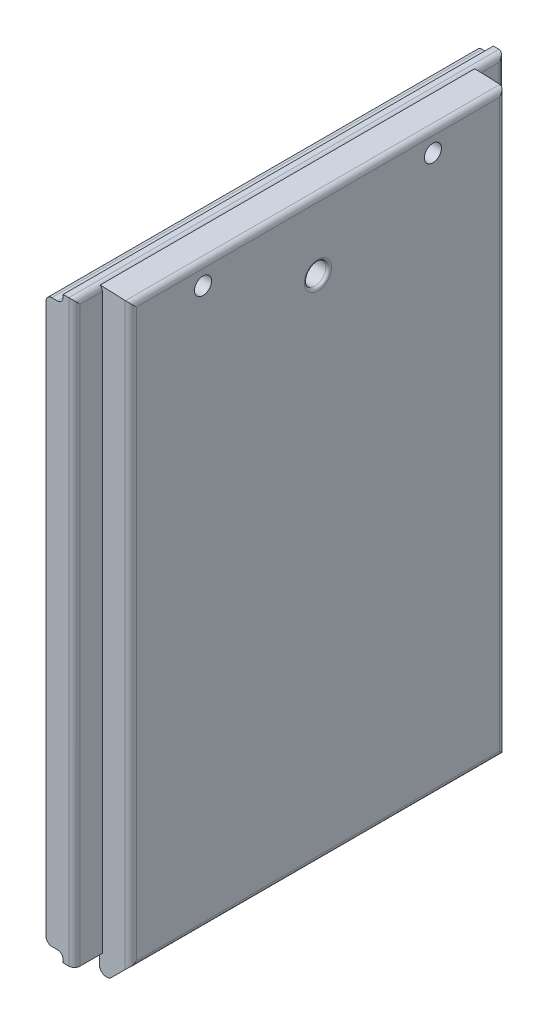
ISO-10303-21;
HEADER;
FILE_DESCRIPTION(('STEP AP214'),'2;1');
FILE_NAME('part.step','',(''),(''),'','','');
FILE_SCHEMA(('AUTOMOTIVE_DESIGN { 1 0 10303 214 1 1 1 1 }'));
ENDSEC;
DATA;
#1=APPLICATION_CONTEXT('core data for automotive mechanical design processes');
#2=APPLICATION_PROTOCOL_DEFINITION('international standard','automotive_design',2000,#1);
#3=PRODUCT_CONTEXT('',#1,'mechanical');
#4=PRODUCT('Part','Part','',(#3));
#5=PRODUCT_RELATED_PRODUCT_CATEGORY('part','',(#4));
#6=PRODUCT_DEFINITION_FORMATION('','',#4);
#7=PRODUCT_DEFINITION_CONTEXT('part definition',#1,'design');
#8=PRODUCT_DEFINITION('design','',#6,#7);
#9=PRODUCT_DEFINITION_SHAPE('','',#8);
#10=(LENGTH_UNIT() NAMED_UNIT(*) SI_UNIT(.MILLI.,.METRE.));
#11=(NAMED_UNIT(*) PLANE_ANGLE_UNIT() SI_UNIT($,.RADIAN.));
#12=(NAMED_UNIT(*) SI_UNIT($,.STERADIAN.) SOLID_ANGLE_UNIT());
#13=UNCERTAINTY_MEASURE_WITH_UNIT(LENGTH_MEASURE(1.E-05),#10,'distance_accuracy_value','');
#14=(GEOMETRIC_REPRESENTATION_CONTEXT(3) GLOBAL_UNCERTAINTY_ASSIGNED_CONTEXT((#13)) GLOBAL_UNIT_ASSIGNED_CONTEXT((#10,
#11,#12)) REPRESENTATION_CONTEXT('',''));
#15=CARTESIAN_POINT('',(0.,0.,0.));
#16=DIRECTION('',(0.,0.,1.));
#17=DIRECTION('',(1.,0.,0.));
#18=AXIS2_PLACEMENT_3D('',#15,#16,#17);
#19=CARTESIAN_POINT('',(-67.5,-51.0099999999999,38.));
#20=DIRECTION('',(-1.,0.,0.));
#21=DIRECTION('',(0.,0.,1.));
#22=AXIS2_PLACEMENT_3D('',#19,#20,#21);
#23=PLANE('',#22);
#24=DIRECTION('',(0.,0.,-1.));
#25=VECTOR('',#24,1.);
#26=CARTESIAN_POINT('',(-67.5,-50.9999999999999,0.));
#27=LINE('',#26,#25);
#28=CARTESIAN_POINT('',(-67.5,-50.9999999999999,-33.));
#29=VERTEX_POINT('',#28);
#30=CARTESIAN_POINT('',(-67.5,-50.9999999999999,-36.9000000000018));
#31=VERTEX_POINT('',#30);
#32=EDGE_CURVE('E279',#29,#31,#27,.T.);
#33=ORIENTED_EDGE('',*,*,#32,.T.);
#34=DIRECTION('',(0.,1.,0.));
#35=VECTOR('',#34,1.);
#36=CARTESIAN_POINT('',(-67.5,-51.0099999999995,-36.9000000000018));
#37=LINE('',#36,#35);
#38=CARTESIAN_POINT('',(-67.5,49.9999999999999,-36.9000000000011));
#39=VERTEX_POINT('',#38);
#40=EDGE_CURVE('E313',#31,#39,#37,.T.);
#41=ORIENTED_EDGE('',*,*,#40,.T.);
#42=DIRECTION('',(0.,0.,1.));
#43=VECTOR('',#42,1.);
#44=CARTESIAN_POINT('',(-67.5,49.9999999999999,37.9000000000011));
#45=LINE('',#44,#43);
#46=CARTESIAN_POINT('',(-67.5,49.9999999999999,-33.));
#47=VERTEX_POINT('',#46);
#48=EDGE_CURVE('E310',#39,#47,#45,.T.);
#49=ORIENTED_EDGE('',*,*,#48,.T.);
#50=DIRECTION('',(0.,1.,0.));
#51=VECTOR('',#50,1.);
#52=CARTESIAN_POINT('',(-67.5,-51.0099999999999,-33.));
#53=LINE('',#52,#51);
#54=EDGE_CURVE('E284',#29,#47,#53,.T.);
#55=ORIENTED_EDGE('',*,*,#54,.F.);
#56=EDGE_LOOP('',(#33,#41,#49,#55));
#57=FACE_BOUND('',#56,.T.);
#58=ADVANCED_FACE('F41',(#57),#23,.F.);
#59=CARTESIAN_POINT('',(-67.5,-51.0099999999999,-33.));
#60=DIRECTION('',(0.,0.,1.));
#61=DIRECTION('',(1.,0.,0.));
#62=AXIS2_PLACEMENT_3D('',#59,#60,#61);
#63=PLANE('',#62);
#64=CARTESIAN_POINT('',(-69.5,-50.9999999999999,-33.));
#65=DIRECTION('',(0.,0.,1.));
#66=DIRECTION('',(1.,0.,0.));
#67=AXIS2_PLACEMENT_3D('',#64,#65,#66);
#68=CIRCLE('',#67,101.8);
#69=CARTESIAN_POINT('',(-63.5,50.6230288861733,-33.));
#70=VERTEX_POINT('',#69);
#71=CARTESIAN_POINT('',(-67.8832523244408,50.7871609141035,-33.));
#72=VERTEX_POINT('',#71);
#73=EDGE_CURVE('E65',#70,#72,#68,.T.);
#74=ORIENTED_EDGE('',*,*,#73,.F.);
#75=DIRECTION('',(0.,-1.,0.));
#76=VECTOR('',#75,1.);
#77=CARTESIAN_POINT('',(-63.5,-50.9999999999999,-33.));
#78=LINE('',#77,#76);
#79=CARTESIAN_POINT('',(-63.5,-51.5,-32.9999999999999));
#80=VERTEX_POINT('',#79);
#81=EDGE_CURVE('E378',#70,#80,#78,.T.);
#82=ORIENTED_EDGE('',*,*,#81,.T.);
#83=DIRECTION('',(-0.707106781186559,-0.707106781186536,0.));
#84=VECTOR('',#83,1.);
#85=CARTESIAN_POINT('',(-62.9999999999999,-50.9999999999999,-32.9999999999999));
#86=LINE('',#85,#84);
#87=CARTESIAN_POINT('',(-65.8786796564404,-53.8786796564403,-32.9999999999999));
#88=VERTEX_POINT('',#87);
#89=EDGE_CURVE('E467',#80,#88,#86,.T.);
#90=ORIENTED_EDGE('',*,*,#89,.T.);
#91=CARTESIAN_POINT('',(-66.7573593128807,-52.9999999999999,-32.9999999999999));
#92=DIRECTION('',(0.,0.,-1.));
#93=DIRECTION('',(-1.,0.,0.));
#94=AXIS2_PLACEMENT_3D('',#91,#92,#93);
#95=CIRCLE('',#94,1.24264068711925);
#96=CARTESIAN_POINT('',(-67.9999999999999,-52.9999999999999,-32.9999999999999));
#97=VERTEX_POINT('',#96);
#98=EDGE_CURVE('E463',#88,#97,#95,.T.);
#99=ORIENTED_EDGE('',*,*,#98,.T.);
#100=DIRECTION('',(0.,1.,0.));
#101=VECTOR('',#100,1.);
#102=CARTESIAN_POINT('',(-67.9999999999999,-50.9999999999999,-32.9999999999999));
#103=LINE('',#102,#101);
#104=CARTESIAN_POINT('',(-67.9999999999999,-50.9999999999999,-32.9999999999999));
#105=VERTEX_POINT('',#104);
#106=EDGE_CURVE('E448',#97,#105,#103,.T.);
#107=ORIENTED_EDGE('',*,*,#106,.T.);
#108=DIRECTION('',(1.,0.,0.));
#109=VECTOR('',#108,1.);
#110=CARTESIAN_POINT('',(-67.9999999999999,-50.9999999999999,-32.9999999999999));
#111=LINE('',#110,#109);
#112=EDGE_CURVE('E470',#105,#29,#111,.T.);
#113=ORIENTED_EDGE('',*,*,#112,.T.);
#114=ORIENTED_EDGE('',*,*,#54,.T.);
#115=CARTESIAN_POINT('',(-68.5,49.9999999999999,-33.));
#116=DIRECTION('',(0.,0.,1.));
#117=DIRECTION('',(1.,0.,0.));
#118=AXIS2_PLACEMENT_3D('',#115,#116,#117);
#119=CIRCLE('',#118,1.);
#120=EDGE_CURVE('E390',#47,#72,#119,.T.);
#121=ORIENTED_EDGE('',*,*,#120,.T.);
#122=EDGE_LOOP('',(#74,#82,#90,#99,#107,#113,#114,#121));
#123=FACE_BOUND('',#122,.T.);
#124=ADVANCED_FACE('F606',(#123),#63,.F.);
#125=CARTESIAN_POINT('',(-67.5,-51.0099999999999,33.));
#126=DIRECTION('',(0.,0.,-1.));
#127=DIRECTION('',(-1.,0.,0.));
#128=AXIS2_PLACEMENT_3D('',#125,#126,#127);
#129=PLANE('',#128);
#130=DIRECTION('',(0.707106781186559,0.707106781186535,0.));
#131=VECTOR('',#130,1.);
#132=CARTESIAN_POINT('',(-62.9999999999999,-50.9999999999999,33.));
#133=LINE('',#132,#131);
#134=CARTESIAN_POINT('',(-65.8786796564404,-53.8786796564403,33.));
#135=VERTEX_POINT('',#134);
#136=CARTESIAN_POINT('',(-63.5,-51.5,33.));
#137=VERTEX_POINT('',#136);
#138=EDGE_CURVE('E438',#135,#137,#133,.T.);
#139=ORIENTED_EDGE('',*,*,#138,.T.);
#140=DIRECTION('',(0.,1.,0.));
#141=VECTOR('',#140,1.);
#142=CARTESIAN_POINT('',(-63.5,50.5590468643735,33.));
#143=LINE('',#142,#141);
#144=CARTESIAN_POINT('',(-63.5,50.6230288861733,33.));
#145=VERTEX_POINT('',#144);
#146=EDGE_CURVE('E387',#137,#145,#143,.T.);
#147=ORIENTED_EDGE('',*,*,#146,.T.);
#148=CARTESIAN_POINT('',(-69.5000000000001,-50.9999999999999,33.));
#149=DIRECTION('',(0.,0.,-1.));
#150=DIRECTION('',(-1.,0.,0.));
#151=AXIS2_PLACEMENT_3D('',#148,#149,#150);
#152=CIRCLE('',#151,101.8);
#153=CARTESIAN_POINT('',(-67.8832523244408,50.7871609141035,33.));
#154=VERTEX_POINT('',#153);
#155=EDGE_CURVE('E58',#154,#145,#152,.T.);
#156=ORIENTED_EDGE('',*,*,#155,.F.);
#157=CARTESIAN_POINT('',(-68.5,49.9999999999999,33.));
#158=DIRECTION('',(0.,0.,-1.));
#159=DIRECTION('',(-1.,0.,0.));
#160=AXIS2_PLACEMENT_3D('',#157,#158,#159);
#161=CIRCLE('',#160,1.);
#162=CARTESIAN_POINT('',(-67.5,49.9999999999999,33.));
#163=VERTEX_POINT('',#162);
#164=EDGE_CURVE('E11',#154,#163,#161,.T.);
#165=ORIENTED_EDGE('',*,*,#164,.T.);
#166=DIRECTION('',(0.,1.,0.));
#167=VECTOR('',#166,1.);
#168=CARTESIAN_POINT('',(-67.5,-51.0099999999999,33.));
#169=LINE('',#168,#167);
#170=CARTESIAN_POINT('',(-67.5,-50.9999999999999,33.));
#171=VERTEX_POINT('',#170);
#172=EDGE_CURVE('E288',#171,#163,#169,.T.);
#173=ORIENTED_EDGE('',*,*,#172,.F.);
#174=DIRECTION('',(-1.,0.,0.));
#175=VECTOR('',#174,1.);
#176=CARTESIAN_POINT('',(-68.,-50.9999999999999,33.));
#177=LINE('',#176,#175);
#178=CARTESIAN_POINT('',(-67.9999999999999,-50.9999999999999,33.));
#179=VERTEX_POINT('',#178);
#180=EDGE_CURVE('E293',#171,#179,#177,.T.);
#181=ORIENTED_EDGE('',*,*,#180,.T.);
#182=DIRECTION('',(0.,-1.,0.));
#183=VECTOR('',#182,1.);
#184=CARTESIAN_POINT('',(-67.9999999999999,-50.9999999999999,33.));
#185=LINE('',#184,#183);
#186=CARTESIAN_POINT('',(-67.9999999999999,-52.9999999999999,33.));
#187=VERTEX_POINT('',#186);
#188=EDGE_CURVE('E442',#179,#187,#185,.T.);
#189=ORIENTED_EDGE('',*,*,#188,.T.);
#190=CARTESIAN_POINT('',(-66.7573593128807,-52.9999999999999,33.));
#191=DIRECTION('',(0.,0.,-1.));
#192=DIRECTION('',(-1.,0.,0.));
#193=AXIS2_PLACEMENT_3D('',#190,#191,#192);
#194=CIRCLE('',#193,1.24264068711925);
#195=EDGE_CURVE('E459',#187,#135,#194,.F.);
#196=ORIENTED_EDGE('',*,*,#195,.T.);
#197=EDGE_LOOP('',(#139,#147,#156,#165,#173,#181,#189,#196));
#198=FACE_BOUND('',#197,.T.);
#199=ADVANCED_FACE('F614',(#198),#129,.F.);
#200=CARTESIAN_POINT('',(0.,50.9999999999999,0.));
#201=DIRECTION('',(0.,1.,0.));
#202=DIRECTION('',(0.,0.,1.));
#203=AXIS2_PLACEMENT_3D('',#200,#201,#202);
#204=PLANE('',#203);
#205=DIRECTION('',(-1.,0.,0.));
#206=VECTOR('',#205,1.);
#207=CARTESIAN_POINT('',(0.,50.9999999999999,37.9000000000011));
#208=LINE('',#207,#206);
#209=CARTESIAN_POINT('',(-68.5,50.9999999999999,37.9000000000011));
#210=VERTEX_POINT('',#209);
#211=CARTESIAN_POINT('',(-69.5,50.9999999999999,37.9000000000011));
#212=VERTEX_POINT('',#211);
#213=EDGE_CURVE('E539',#210,#212,#208,.T.);
#214=ORIENTED_EDGE('',*,*,#213,.F.);
#215=DIRECTION('',(0.,0.,1.));
#216=VECTOR('',#215,1.);
#217=CARTESIAN_POINT('',(-68.5,50.9999999999999,-37.9000000000011));
#218=LINE('',#217,#216);
#219=CARTESIAN_POINT('',(-68.5,50.9999999999999,-37.9000000000011));
#220=VERTEX_POINT('',#219);
#221=EDGE_CURVE('E329',#210,#220,#218,.F.);
#222=ORIENTED_EDGE('',*,*,#221,.T.);
#223=DIRECTION('',(1.,0.,0.));
#224=VECTOR('',#223,1.);
#225=CARTESIAN_POINT('',(0.,50.9999999999999,-37.9000000000011));
#226=LINE('',#225,#224);
#227=CARTESIAN_POINT('',(-69.5,50.9999999999999,-37.9000000000011));
#228=VERTEX_POINT('',#227);
#229=EDGE_CURVE('E514',#228,#220,#226,.T.);
#230=ORIENTED_EDGE('',*,*,#229,.F.);
#231=DIRECTION('',(0.,0.,-1.));
#232=VECTOR('',#231,1.);
#233=CARTESIAN_POINT('',(-69.5,50.9999999999999,43.));
#234=LINE('',#233,#232);
#235=EDGE_CURVE('E252',#212,#228,#234,.T.);
#236=ORIENTED_EDGE('',*,*,#235,.F.);
#237=EDGE_LOOP('',(#214,#222,#230,#236));
#238=FACE_BOUND('',#237,.T.);
#239=ADVANCED_FACE('F598',(#238),#204,.T.);
#240=CARTESIAN_POINT('',(-62.5,62.5,53.));
#241=DIRECTION('',(1.,0.,0.));
#242=DIRECTION('',(0.,0.,-1.));
#243=AXIS2_PLACEMENT_3D('',#240,#241,#242);
#244=PLANE('',#243);
#245=DIRECTION('',(0.,0.,-1.));
#246=VECTOR('',#245,1.);
#247=CARTESIAN_POINT('',(-62.5,-50.1339745962155,-33.));
#248=LINE('',#247,#246);
#249=CARTESIAN_POINT('',(-62.5,-50.1339745962155,32.));
#250=VERTEX_POINT('',#249);
#251=CARTESIAN_POINT('',(-62.5,-50.1339745962155,-32.));
#252=VERTEX_POINT('',#251);
#253=EDGE_CURVE('E338',#250,#252,#248,.T.);
#254=ORIENTED_EDGE('',*,*,#253,.T.);
#255=DIRECTION('',(0.,-1.,0.));
#256=VECTOR('',#255,1.);
#257=CARTESIAN_POINT('',(-62.5,50.5590468643735,-32.));
#258=LINE('',#257,#256);
#259=CARTESIAN_POINT('',(-62.5,49.6212701172074,-32.));
#260=VERTEX_POINT('',#259);
#261=EDGE_CURVE('E342',#252,#260,#258,.F.);
#262=ORIENTED_EDGE('',*,*,#261,.T.);
#263=DIRECTION('',(0.,0.,-1.));
#264=VECTOR('',#263,1.);
#265=CARTESIAN_POINT('',(-62.5,49.6212701172074,53.));
#266=LINE('',#265,#264);
#267=CARTESIAN_POINT('',(-62.5,49.6212701172074,32.));
#268=VERTEX_POINT('',#267);
#269=EDGE_CURVE('E335',#260,#268,#266,.F.);
#270=ORIENTED_EDGE('',*,*,#269,.T.);
#271=DIRECTION('',(0.,1.,0.));
#272=VECTOR('',#271,1.);
#273=CARTESIAN_POINT('',(-62.5,-50.9999999999999,32.));
#274=LINE('',#273,#272);
#275=EDGE_CURVE('E332',#268,#250,#274,.F.);
#276=ORIENTED_EDGE('',*,*,#275,.T.);
#277=EDGE_LOOP('',(#254,#262,#270,#276));
#278=FACE_BOUND('',#277,.T.);
#279=CARTESIAN_POINT('',(-62.5,38.5,0.));
#280=DIRECTION('',(1.,0.,0.));
#281=DIRECTION('',(0.,0.,-1.));
#282=AXIS2_PLACEMENT_3D('',#279,#280,#281);
#283=CIRCLE('',#282,2.4);
#284=CARTESIAN_POINT('',(-62.5,38.5,-2.4));
#285=VERTEX_POINT('',#284);
#286=EDGE_CURVE('E300',#285,#285,#283,.F.);
#287=ORIENTED_EDGE('',*,*,#286,.T.);
#288=EDGE_LOOP('',(#287));
#289=FACE_BOUND('',#288,.T.);
#290=CARTESIAN_POINT('',(-62.5,46.9999999999999,-20.25));
#291=DIRECTION('',(-1.,0.,0.));
#292=DIRECTION('',(0.,0.,1.));
#293=AXIS2_PLACEMENT_3D('',#290,#291,#292);
#294=CIRCLE('',#293,1.5);
#295=CARTESIAN_POINT('',(-62.5,46.9999999999999,-18.75));
#296=VERTEX_POINT('',#295);
#297=EDGE_CURVE('E495',#296,#296,#294,.T.);
#298=ORIENTED_EDGE('',*,*,#297,.T.);
#299=EDGE_LOOP('',(#298));
#300=FACE_BOUND('',#299,.T.);
#301=CARTESIAN_POINT('',(-62.5,46.9999999999999,20.25));
#302=DIRECTION('',(1.,0.,0.));
#303=DIRECTION('',(0.,0.,-1.));
#304=AXIS2_PLACEMENT_3D('',#301,#302,#303);
#305=CIRCLE('',#304,1.5);
#306=CARTESIAN_POINT('',(-62.5,46.9999999999999,18.75));
#307=VERTEX_POINT('',#306);
#308=EDGE_CURVE('E487',#307,#307,#305,.T.);
#309=ORIENTED_EDGE('',*,*,#308,.F.);
#310=EDGE_LOOP('',(#309));
#311=FACE_BOUND('',#310,.T.);
#312=ADVANCED_FACE('F632',(#278,#289,#300,#311),#244,.T.);
#313=DIRECTION('',(0.,0.,1.));
#314=VECTOR('',#313,1.);
#315=CARTESIAN_POINT('',(-67.5,49.9999999999999,37.9000000000011));
#316=LINE('',#315,#314);
#317=CARTESIAN_POINT('',(-67.5,49.9999999999999,36.9000000000011));
#318=VERTEX_POINT('',#317);
#319=EDGE_CURVE('E304',#163,#318,#316,.T.);
#320=ORIENTED_EDGE('',*,*,#319,.T.);
#321=DIRECTION('',(0.,-1.,0.));
#322=VECTOR('',#321,1.);
#323=CARTESIAN_POINT('',(-67.5,-51.0099999999999,36.9000000000018));
#324=LINE('',#323,#322);
#325=CARTESIAN_POINT('',(-67.5,-50.9999999999999,36.9000000000018));
#326=VERTEX_POINT('',#325);
#327=EDGE_CURVE('E307',#318,#326,#324,.T.);
#328=ORIENTED_EDGE('',*,*,#327,.T.);
#329=DIRECTION('',(0.,0.,-1.));
#330=VECTOR('',#329,1.);
#331=CARTESIAN_POINT('',(-67.5,-50.9999999999999,0.));
#332=LINE('',#331,#330);
#333=EDGE_CURVE('E283',#326,#171,#332,.T.);
#334=ORIENTED_EDGE('',*,*,#333,.T.);
#335=ORIENTED_EDGE('',*,*,#172,.T.);
#336=EDGE_LOOP('',(#320,#328,#334,#335));
#337=FACE_BOUND('',#336,.T.);
#338=ADVANCED_FACE('F635',(#337),#23,.F.);
#339=CARTESIAN_POINT('',(-72.5,62.5,53.));
#340=DIRECTION('',(1.,0.,0.));
#341=DIRECTION('',(0.,0.,-1.));
#342=AXIS2_PLACEMENT_3D('',#339,#340,#341);
#343=PLANE('',#342);
#344=DIRECTION('',(0.,0.,-1.));
#345=VECTOR('',#344,1.);
#346=CARTESIAN_POINT('',(-72.5,48.5,-43.));
#347=LINE('',#346,#345);
#348=CARTESIAN_POINT('',(-72.5,48.5,37.9000000000011));
#349=VERTEX_POINT('',#348);
#350=CARTESIAN_POINT('',(-72.5,48.5,-37.9000000000011));
#351=VERTEX_POINT('',#350);
#352=EDGE_CURVE('E235',#349,#351,#347,.T.);
#353=ORIENTED_EDGE('',*,*,#352,.T.);
#354=DIRECTION('',(0.,1.,0.));
#355=VECTOR('',#354,1.);
#356=CARTESIAN_POINT('',(-72.5,75.,-37.900000000001));
#357=LINE('',#356,#355);
#358=CARTESIAN_POINT('',(-72.5,-48.5,-37.9000000000017));
#359=VERTEX_POINT('',#358);
#360=EDGE_CURVE('E239',#359,#351,#357,.T.);
#361=ORIENTED_EDGE('',*,*,#360,.F.);
#362=DIRECTION('',(0.,0.,-1.));
#363=VECTOR('',#362,1.);
#364=CARTESIAN_POINT('',(-72.5,-48.5,-43.));
#365=LINE('',#364,#363);
#366=CARTESIAN_POINT('',(-72.5,-48.5,37.9000000000017));
#367=VERTEX_POINT('',#366);
#368=EDGE_CURVE('E237',#367,#359,#365,.T.);
#369=ORIENTED_EDGE('',*,*,#368,.F.);
#370=DIRECTION('',(0.,-1.,0.));
#371=VECTOR('',#370,1.);
#372=CARTESIAN_POINT('',(-72.5,75.,37.900000000001));
#373=LINE('',#372,#371);
#374=EDGE_CURVE('E219',#349,#367,#373,.T.);
#375=ORIENTED_EDGE('',*,*,#374,.F.);
#376=EDGE_LOOP('',(#353,#361,#369,#375));
#377=FACE_BOUND('',#376,.T.);
#378=ADVANCED_FACE('F233',(#377),#343,.F.);
#379=CARTESIAN_POINT('',(-71.5,48.5,53.));
#380=DIRECTION('',(0.,0.,1.));
#381=DIRECTION('',(1.,0.,0.));
#382=AXIS2_PLACEMENT_3D('',#379,#380,#381);
#383=CYLINDRICAL_SURFACE('',#382,1.);
#384=CARTESIAN_POINT('',(-71.5,48.5,-37.9000000000011));
#385=DIRECTION('',(0.,0.,1.));
#386=DIRECTION('',(0.,-1.,0.));
#387=AXIS2_PLACEMENT_3D('',#384,#385,#386);
#388=CIRCLE('',#387,1.);
#389=CARTESIAN_POINT('',(-71.5,49.5,-37.9000000000011));
#390=VERTEX_POINT('',#389);
#391=EDGE_CURVE('E244',#351,#390,#388,.F.);
#392=ORIENTED_EDGE('',*,*,#391,.F.);
#393=ORIENTED_EDGE('',*,*,#352,.F.);
#394=CARTESIAN_POINT('',(-71.5,48.5,37.9000000000011));
#395=DIRECTION('',(0.,0.,-1.));
#396=DIRECTION('',(0.,1.,0.));
#397=AXIS2_PLACEMENT_3D('',#394,#395,#396);
#398=CIRCLE('',#397,1.);
#399=CARTESIAN_POINT('',(-71.5,49.5,37.9000000000011));
#400=VERTEX_POINT('',#399);
#401=EDGE_CURVE('E215',#400,#349,#398,.F.);
#402=ORIENTED_EDGE('',*,*,#401,.F.);
#403=DIRECTION('',(0.,0.,-1.));
#404=VECTOR('',#403,1.);
#405=CARTESIAN_POINT('',(-71.5,49.5,43.));
#406=LINE('',#405,#404);
#407=EDGE_CURVE('E262',#390,#400,#406,.F.);
#408=ORIENTED_EDGE('',*,*,#407,.F.);
#409=EDGE_LOOP('',(#392,#393,#402,#408));
#410=FACE_BOUND('',#409,.T.);
#411=ADVANCED_FACE('F243',(#410),#383,.T.);
#412=CARTESIAN_POINT('',(0.,49.5,0.));
#413=DIRECTION('',(0.,1.,0.));
#414=DIRECTION('',(0.,0.,1.));
#415=AXIS2_PLACEMENT_3D('',#412,#413,#414);
#416=PLANE('',#415);
#417=DIRECTION('',(1.,0.,0.));
#418=VECTOR('',#417,1.);
#419=CARTESIAN_POINT('',(0.,49.5,-37.9000000000011));
#420=LINE('',#419,#418);
#421=CARTESIAN_POINT('',(-70.5,49.5,-37.9000000000011));
#422=VERTEX_POINT('',#421);
#423=EDGE_CURVE('E504',#390,#422,#420,.T.);
#424=ORIENTED_EDGE('',*,*,#423,.F.);
#425=ORIENTED_EDGE('',*,*,#407,.T.);
#426=DIRECTION('',(-1.,0.,0.));
#427=VECTOR('',#426,1.);
#428=CARTESIAN_POINT('',(0.,49.5,37.9000000000011));
#429=LINE('',#428,#427);
#430=CARTESIAN_POINT('',(-70.5,49.5,37.9000000000011));
#431=VERTEX_POINT('',#430);
#432=EDGE_CURVE('E222',#431,#400,#429,.T.);
#433=ORIENTED_EDGE('',*,*,#432,.F.);
#434=DIRECTION('',(0.,0.,-1.));
#435=VECTOR('',#434,1.);
#436=CARTESIAN_POINT('',(-70.5,49.5,-43.));
#437=LINE('',#436,#435);
#438=EDGE_CURVE('E255',#431,#422,#437,.T.);
#439=ORIENTED_EDGE('',*,*,#438,.T.);
#440=EDGE_LOOP('',(#424,#425,#433,#439));
#441=FACE_BOUND('',#440,.T.);
#442=ADVANCED_FACE('F683',(#441),#416,.T.);
#443=CARTESIAN_POINT('',(-70.5,50.5,0.));
#444=DIRECTION('',(0.,0.,1.));
#445=DIRECTION('',(1.,0.,0.));
#446=AXIS2_PLACEMENT_3D('',#443,#444,#445);
#447=CYLINDRICAL_SURFACE('',#446,1.);
#448=DIRECTION('',(0.,0.,-1.));
#449=VECTOR('',#448,1.);
#450=CARTESIAN_POINT('',(-69.5,50.5,43.));
#451=LINE('',#450,#449);
#452=CARTESIAN_POINT('',(-69.5,50.5,-37.9000000000011));
#453=VERTEX_POINT('',#452);
#454=CARTESIAN_POINT('',(-69.5,50.5,37.9000000000011));
#455=VERTEX_POINT('',#454);
#456=EDGE_CURVE('E247',#453,#455,#451,.F.);
#457=ORIENTED_EDGE('',*,*,#456,.F.);
#458=CARTESIAN_POINT('',(-70.5,50.5,-37.9000000000011));
#459=DIRECTION('',(0.,0.,1.));
#460=DIRECTION('',(0.,-1.,0.));
#461=AXIS2_PLACEMENT_3D('',#458,#459,#460);
#462=CIRCLE('',#461,1.);
#463=EDGE_CURVE('E507',#453,#422,#462,.F.);
#464=ORIENTED_EDGE('',*,*,#463,.T.);
#465=ORIENTED_EDGE('',*,*,#438,.F.);
#466=CARTESIAN_POINT('',(-70.5,50.5,37.9000000000011));
#467=DIRECTION('',(0.,0.,-1.));
#468=DIRECTION('',(0.,1.,0.));
#469=AXIS2_PLACEMENT_3D('',#466,#467,#468);
#470=CIRCLE('',#469,1.);
#471=EDGE_CURVE('E532',#431,#455,#470,.F.);
#472=ORIENTED_EDGE('',*,*,#471,.T.);
#473=EDGE_LOOP('',(#457,#464,#465,#472));
#474=FACE_BOUND('',#473,.T.);
#475=ADVANCED_FACE('F686',(#474),#447,.F.);
#476=CARTESIAN_POINT('',(-69.5,-130.113473882112,43.));
#477=DIRECTION('',(-1.,0.,0.));
#478=DIRECTION('',(0.,0.,1.));
#479=AXIS2_PLACEMENT_3D('',#476,#477,#478);
#480=PLANE('',#479);
#481=DIRECTION('',(0.,1.,0.));
#482=VECTOR('',#481,1.);
#483=CARTESIAN_POINT('',(-69.5,-130.113473882111,-37.9000000000023));
#484=LINE('',#483,#482);
#485=EDGE_CURVE('E511',#453,#228,#484,.T.);
#486=ORIENTED_EDGE('',*,*,#485,.F.);
#487=ORIENTED_EDGE('',*,*,#456,.T.);
#488=DIRECTION('',(0.,-1.,0.));
#489=VECTOR('',#488,1.);
#490=CARTESIAN_POINT('',(-69.5,-130.113473882112,37.9000000000023));
#491=LINE('',#490,#489);
#492=EDGE_CURVE('E536',#212,#455,#491,.T.);
#493=ORIENTED_EDGE('',*,*,#492,.F.);
#494=ORIENTED_EDGE('',*,*,#235,.T.);
#495=EDGE_LOOP('',(#486,#487,#493,#494));
#496=FACE_BOUND('',#495,.T.);
#497=ADVANCED_FACE('F888',(#496),#480,.T.);
#498=CARTESIAN_POINT('',(-71.5,-48.5,53.));
#499=DIRECTION('',(0.,0.,1.));
#500=DIRECTION('',(1.,0.,0.));
#501=AXIS2_PLACEMENT_3D('',#498,#499,#500);
#502=CYLINDRICAL_SURFACE('',#501,1.);
#503=CARTESIAN_POINT('',(-71.5,-48.5,-37.9000000000017));
#504=DIRECTION('',(0.,0.,1.));
#505=DIRECTION('',(0.,-1.,0.));
#506=AXIS2_PLACEMENT_3D('',#503,#504,#505);
#507=CIRCLE('',#506,1.);
#508=CARTESIAN_POINT('',(-71.5,-49.5,-37.9000000000018));
#509=VERTEX_POINT('',#508);
#510=EDGE_CURVE('E518',#509,#359,#507,.F.);
#511=ORIENTED_EDGE('',*,*,#510,.F.);
#512=DIRECTION('',(0.,0.,-1.));
#513=VECTOR('',#512,1.);
#514=CARTESIAN_POINT('',(-71.5,-49.5,43.));
#515=LINE('',#514,#513);
#516=CARTESIAN_POINT('',(-71.5,-49.5,37.9000000000018));
#517=VERTEX_POINT('',#516);
#518=EDGE_CURVE('E275',#509,#517,#515,.F.);
#519=ORIENTED_EDGE('',*,*,#518,.T.);
#520=CARTESIAN_POINT('',(-71.5,-48.5,37.9000000000018));
#521=DIRECTION('',(0.,0.,-1.));
#522=DIRECTION('',(0.,1.,0.));
#523=AXIS2_PLACEMENT_3D('',#520,#521,#522);
#524=CIRCLE('',#523,1.);
#525=EDGE_CURVE('E542',#367,#517,#524,.F.);
#526=ORIENTED_EDGE('',*,*,#525,.F.);
#527=ORIENTED_EDGE('',*,*,#368,.T.);
#528=EDGE_LOOP('',(#511,#519,#526,#527));
#529=FACE_BOUND('',#528,.T.);
#530=ADVANCED_FACE('F561',(#529),#502,.T.);
#531=CARTESIAN_POINT('',(0.,-49.5,0.));
#532=DIRECTION('',(0.,-1.,0.));
#533=DIRECTION('',(0.,0.,1.));
#534=AXIS2_PLACEMENT_3D('',#531,#532,#533);
#535=PLANE('',#534);
#536=DIRECTION('',(-1.,0.,0.));
#537=VECTOR('',#536,1.);
#538=CARTESIAN_POINT('',(0.,-49.5,-37.9000000000018));
#539=LINE('',#538,#537);
#540=CARTESIAN_POINT('',(-70.5,-49.5,-37.9000000000018));
#541=VERTEX_POINT('',#540);
#542=EDGE_CURVE('E521',#541,#509,#539,.T.);
#543=ORIENTED_EDGE('',*,*,#542,.F.);
#544=DIRECTION('',(0.,0.,-1.));
#545=VECTOR('',#544,1.);
#546=CARTESIAN_POINT('',(-70.5,-49.5,-43.));
#547=LINE('',#546,#545);
#548=CARTESIAN_POINT('',(-70.5,-49.5,37.9000000000018));
#549=VERTEX_POINT('',#548);
#550=EDGE_CURVE('E271',#549,#541,#547,.T.);
#551=ORIENTED_EDGE('',*,*,#550,.F.);
#552=DIRECTION('',(1.,0.,0.));
#553=VECTOR('',#552,1.);
#554=CARTESIAN_POINT('',(0.,-49.5,37.9000000000018));
#555=LINE('',#554,#553);
#556=EDGE_CURVE('E545',#517,#549,#555,.T.);
#557=ORIENTED_EDGE('',*,*,#556,.F.);
#558=ORIENTED_EDGE('',*,*,#518,.F.);
#559=EDGE_LOOP('',(#543,#551,#557,#558));
#560=FACE_BOUND('',#559,.T.);
#561=ADVANCED_FACE('F567',(#560),#535,.T.);
#562=CARTESIAN_POINT('',(-70.5,-50.5,0.));
#563=DIRECTION('',(0.,0.,1.));
#564=DIRECTION('',(1.,0.,0.));
#565=AXIS2_PLACEMENT_3D('',#562,#563,#564);
#566=CYLINDRICAL_SURFACE('',#565,1.);
#567=ORIENTED_EDGE('',*,*,#550,.T.);
#568=CARTESIAN_POINT('',(-70.5,-50.5,-37.9000000000018));
#569=DIRECTION('',(0.,0.,1.));
#570=DIRECTION('',(0.,-1.,0.));
#571=AXIS2_PLACEMENT_3D('',#568,#569,#570);
#572=CIRCLE('',#571,1.);
#573=CARTESIAN_POINT('',(-69.5,-50.5,-37.9000000000017));
#574=VERTEX_POINT('',#573);
#575=EDGE_CURVE('E524',#541,#574,#572,.F.);
#576=ORIENTED_EDGE('',*,*,#575,.T.);
#577=DIRECTION('',(0.,0.,-1.));
#578=VECTOR('',#577,1.);
#579=CARTESIAN_POINT('',(-69.5,-50.5,43.));
#580=LINE('',#579,#578);
#581=CARTESIAN_POINT('',(-69.5,-50.5,37.9000000000018));
#582=VERTEX_POINT('',#581);
#583=EDGE_CURVE('E267',#574,#582,#580,.F.);
#584=ORIENTED_EDGE('',*,*,#583,.T.);
#585=CARTESIAN_POINT('',(-70.5,-50.5,37.9000000000018));
#586=DIRECTION('',(0.,0.,-1.));
#587=DIRECTION('',(0.,1.,0.));
#588=AXIS2_PLACEMENT_3D('',#585,#586,#587);
#589=CIRCLE('',#588,1.);
#590=EDGE_CURVE('E548',#582,#549,#589,.F.);
#591=ORIENTED_EDGE('',*,*,#590,.T.);
#592=EDGE_LOOP('',(#567,#576,#584,#591));
#593=FACE_BOUND('',#592,.T.);
#594=ADVANCED_FACE('F569',(#593),#566,.F.);
#595=CARTESIAN_POINT('',(0.,-50.9999999999999,0.));
#596=DIRECTION('',(0.,-1.,0.));
#597=DIRECTION('',(0.,0.,-1.));
#598=AXIS2_PLACEMENT_3D('',#595,#596,#597);
#599=PLANE('',#598);
#600=DIRECTION('',(-1.,0.,0.));
#601=VECTOR('',#600,1.);
#602=CARTESIAN_POINT('',(0.,-50.9999999999999,-37.9000000000018));
#603=LINE('',#602,#601);
#604=CARTESIAN_POINT('',(-68.5,-50.9999999999999,-37.9000000000018));
#605=VERTEX_POINT('',#604);
#606=CARTESIAN_POINT('',(-69.5,-50.9999999999999,-37.9000000000018));
#607=VERTEX_POINT('',#606);
#608=EDGE_CURVE('E228',#605,#607,#603,.T.);
#609=ORIENTED_EDGE('',*,*,#608,.F.);
#610=CARTESIAN_POINT('',(-68.5,-50.9999999999999,-36.9000000000018));
#611=DIRECTION('',(0.,-1.,0.));
#612=DIRECTION('',(0.,0.,-1.));
#613=AXIS2_PLACEMENT_3D('',#610,#611,#612);
#614=CIRCLE('',#613,1.);
#615=EDGE_CURVE('E323',#605,#31,#614,.T.);
#616=ORIENTED_EDGE('',*,*,#615,.T.);
#617=ORIENTED_EDGE('',*,*,#32,.F.);
#618=ORIENTED_EDGE('',*,*,#112,.F.);
#619=DIRECTION('',(0.,0.,-1.));
#620=VECTOR('',#619,1.);
#621=CARTESIAN_POINT('',(-67.9999999999999,-50.9999999999999,38.9594226755417));
#622=LINE('',#621,#620);
#623=EDGE_CURVE('E455',#179,#105,#622,.T.);
#624=ORIENTED_EDGE('',*,*,#623,.F.);
#625=ORIENTED_EDGE('',*,*,#180,.F.);
#626=ORIENTED_EDGE('',*,*,#333,.F.);
#627=CARTESIAN_POINT('',(-68.5,-50.9999999999999,36.9000000000018));
#628=DIRECTION('',(0.,-1.,0.));
#629=DIRECTION('',(0.,0.,-1.));
#630=AXIS2_PLACEMENT_3D('',#627,#628,#629);
#631=CIRCLE('',#630,1.);
#632=CARTESIAN_POINT('',(-68.5,-50.9999999999999,37.9000000000018));
#633=VERTEX_POINT('',#632);
#634=EDGE_CURVE('E320',#326,#633,#631,.T.);
#635=ORIENTED_EDGE('',*,*,#634,.T.);
#636=DIRECTION('',(1.,0.,0.));
#637=VECTOR('',#636,1.);
#638=CARTESIAN_POINT('',(0.,-50.9999999999999,37.9000000000018));
#639=LINE('',#638,#637);
#640=CARTESIAN_POINT('',(-69.5,-50.9999999999999,37.9000000000018));
#641=VERTEX_POINT('',#640);
#642=EDGE_CURVE('E552',#641,#633,#639,.T.);
#643=ORIENTED_EDGE('',*,*,#642,.F.);
#644=DIRECTION('',(0.,0.,1.));
#645=VECTOR('',#644,1.);
#646=CARTESIAN_POINT('',(-69.5,-50.9999999999999,43.));
#647=LINE('',#646,#645);
#648=EDGE_CURVE('E246',#607,#641,#647,.T.);
#649=ORIENTED_EDGE('',*,*,#648,.F.);
#650=EDGE_LOOP('',(#609,#616,#617,#618,#624,#625,#626,#635,#643,#649));
#651=FACE_BOUND('',#650,.T.);
#652=ADVANCED_FACE('F579',(#651),#599,.T.);
#653=CARTESIAN_POINT('',(-69.5,130.113473882112,43.));
#654=DIRECTION('',(-1.,0.,0.));
#655=DIRECTION('',(0.,0.,1.));
#656=AXIS2_PLACEMENT_3D('',#653,#654,#655);
#657=PLANE('',#656);
#658=DIRECTION('',(0.,1.,0.));
#659=VECTOR('',#658,1.);
#660=CARTESIAN_POINT('',(-69.5,130.113473882112,-37.9000000000006));
#661=LINE('',#660,#659);
#662=EDGE_CURVE('E292',#607,#574,#661,.T.);
#663=ORIENTED_EDGE('',*,*,#662,.F.);
#664=ORIENTED_EDGE('',*,*,#648,.T.);
#665=DIRECTION('',(0.,-1.,0.));
#666=VECTOR('',#665,1.);
#667=CARTESIAN_POINT('',(-69.5,130.113473882112,37.9000000000006));
#668=LINE('',#667,#666);
#669=EDGE_CURVE('E289',#582,#641,#668,.T.);
#670=ORIENTED_EDGE('',*,*,#669,.F.);
#671=ORIENTED_EDGE('',*,*,#583,.F.);
#672=EDGE_LOOP('',(#663,#664,#670,#671));
#673=FACE_BOUND('',#672,.T.);
#674=ADVANCED_FACE('F575',(#673),#657,.T.);
#675=CARTESIAN_POINT('',(-67.9999999999999,-50.9999999999999,38.9594226755417));
#676=DIRECTION('',(-1.,0.,0.));
#677=DIRECTION('',(0.,0.,1.));
#678=AXIS2_PLACEMENT_3D('',#675,#676,#677);
#679=PLANE('',#678);
#680=ORIENTED_EDGE('',*,*,#188,.F.);
#681=ORIENTED_EDGE('',*,*,#623,.T.);
#682=ORIENTED_EDGE('',*,*,#106,.F.);
#683=DIRECTION('',(0.,0.,-1.));
#684=VECTOR('',#683,1.);
#685=CARTESIAN_POINT('',(-67.9999999999999,-52.9999999999999,38.9594226755417));
#686=LINE('',#685,#684);
#687=EDGE_CURVE('E452',#187,#97,#686,.T.);
#688=ORIENTED_EDGE('',*,*,#687,.F.);
#689=EDGE_LOOP('',(#680,#681,#682,#688));
#690=FACE_BOUND('',#689,.T.);
#691=ADVANCED_FACE('F611',(#690),#679,.T.);
#692=CARTESIAN_POINT('',(-66.7573593128807,-52.9999999999999,38.9594226755417));
#693=DIRECTION('',(0.,0.,-1.));
#694=DIRECTION('',(-1.,0.,0.));
#695=AXIS2_PLACEMENT_3D('',#692,#693,#694);
#696=CYLINDRICAL_SURFACE('',#695,1.24264068711925);
#697=ORIENTED_EDGE('',*,*,#195,.F.);
#698=ORIENTED_EDGE('',*,*,#687,.T.);
#699=ORIENTED_EDGE('',*,*,#98,.F.);
#700=DIRECTION('',(0.,0.,-1.));
#701=VECTOR('',#700,1.);
#702=CARTESIAN_POINT('',(-65.8786796564404,-53.8786796564403,38.9594226755417));
#703=LINE('',#702,#701);
#704=EDGE_CURVE('E447',#135,#88,#703,.T.);
#705=ORIENTED_EDGE('',*,*,#704,.F.);
#706=EDGE_LOOP('',(#697,#698,#699,#705));
#707=FACE_BOUND('',#706,.T.);
#708=ADVANCED_FACE('F618',(#707),#696,.T.);
#709=CARTESIAN_POINT('',(-62.9999999999999,-50.9999999999999,38.9594226755417));
#710=DIRECTION('',(0.707106781186535,-0.707106781186559,0.));
#711=DIRECTION('',(0.70710678118656,0.707106781186536,0.));
#712=AXIS2_PLACEMENT_3D('',#709,#710,#711);
#713=PLANE('',#712);
#714=ORIENTED_EDGE('',*,*,#89,.F.);
#715=CARTESIAN_POINT('',(-63.5,-51.5,-32.));
#716=DIRECTION('',(0.707106781186535,-0.707106781186559,0.));
#717=DIRECTION('',(0.70710678118656,0.707106781186536,0.));
#718=AXIS2_PLACEMENT_3D('',#715,#716,#717);
#719=ELLIPSE('',#718,1.41421356237307,1.);
#720=CARTESIAN_POINT('',(-62.9999999999999,-50.9999999999999,-32.8660254037844));
#721=VERTEX_POINT('',#720);
#722=EDGE_CURVE('E384',#80,#721,#719,.T.);
#723=ORIENTED_EDGE('',*,*,#722,.T.);
#724=DIRECTION('',(0.,0.,-1.));
#725=VECTOR('',#724,1.);
#726=CARTESIAN_POINT('',(-62.9999999999999,-50.9999999999999,38.9594226755417));
#727=LINE('',#726,#725);
#728=CARTESIAN_POINT('',(-62.9999999999999,-50.9999999999999,32.8660254037844));
#729=VERTEX_POINT('',#728);
#730=EDGE_CURVE('E443',#729,#721,#727,.T.);
#731=ORIENTED_EDGE('',*,*,#730,.F.);
#732=CARTESIAN_POINT('',(-63.5,-51.5,32.));
#733=DIRECTION('',(0.707106781186535,-0.707106781186559,0.));
#734=DIRECTION('',(-0.70710678118656,-0.707106781186536,0.));
#735=AXIS2_PLACEMENT_3D('',#732,#733,#734);
#736=ELLIPSE('',#735,1.41421356237307,1.);
#737=EDGE_CURVE('E381',#729,#137,#736,.T.);
#738=ORIENTED_EDGE('',*,*,#737,.T.);
#739=ORIENTED_EDGE('',*,*,#138,.F.);
#740=ORIENTED_EDGE('',*,*,#704,.T.);
#741=EDGE_LOOP('',(#714,#723,#731,#738,#739,#740));
#742=FACE_BOUND('',#741,.T.);
#743=ADVANCED_FACE('F623',(#742),#713,.T.);
#744=CARTESIAN_POINT('',(-69.5000000000001,-50.9999999999999,38.));
#745=DIRECTION('',(0.,0.,-1.));
#746=DIRECTION('',(-1.,0.,0.));
#747=AXIS2_PLACEMENT_3D('',#744,#745,#746);
#748=CYLINDRICAL_SURFACE('',#747,101.8);
#749=DIRECTION('',(0.,0.,-1.));
#750=VECTOR('',#749,1.);
#751=CARTESIAN_POINT('',(-63.4404761904762,50.6194970032908,38.));
#752=LINE('',#751,#750);
#753=CARTESIAN_POINT('',(-63.4404761904762,50.6194970032908,32.9982268860834));
#754=VERTEX_POINT('',#753);
#755=CARTESIAN_POINT('',(-63.4404761904761,50.6194970032908,-32.9982268860834));
#756=VERTEX_POINT('',#755);
#757=EDGE_CURVE('E353',#754,#756,#752,.T.);
#758=ORIENTED_EDGE('',*,*,#757,.T.);
#759=CARTESIAN_POINT('',(-63.4404761904761,50.6194970032908,-32.9982268860834));
#760=CARTESIAN_POINT('',(-63.4503878829412,50.6200880355256,-32.998817854316));
#761=CARTESIAN_POINT('',(-63.460304046634,50.6206778752165,-32.9992610979254));
#762=CARTESIAN_POINT('',(-63.4801453164754,50.6218551695107,-32.9998521358976));
#763=CARTESIAN_POINT('',(-63.4900704226238,50.6224426241139,-32.9999999302604));
#764=CARTESIAN_POINT('',(-63.5,50.6230288861733,-33.));
#765=B_SPLINE_CURVE_WITH_KNOTS('',3,(#759,#760,#761,#762,#763,#764),.UNSPECIFIED.,.F.,.F.,(4,2,
4),(0.,0.0298307241494193,0.0596614482988529),.UNSPECIFIED.);
#766=EDGE_CURVE('E371',#756,#70,#765,.T.);
#767=ORIENTED_EDGE('',*,*,#766,.T.);
#768=ORIENTED_EDGE('',*,*,#73,.T.);
#769=DIRECTION('',(0.,0.,-1.));
#770=VECTOR('',#769,1.);
#771=CARTESIAN_POINT('',(-67.8832523244408,50.7871609141035,-33.));
#772=LINE('',#771,#770);
#773=EDGE_CURVE('E51',#72,#154,#772,.F.);
#774=ORIENTED_EDGE('',*,*,#773,.T.);
#775=ORIENTED_EDGE('',*,*,#155,.T.);
#776=CARTESIAN_POINT('',(-63.5,50.6230288861733,33.));
#777=CARTESIAN_POINT('',(-63.4900704226238,50.6224426241139,32.9999999302604));
#778=CARTESIAN_POINT('',(-63.4801453164754,50.6218551695107,32.9998521358976));
#779=CARTESIAN_POINT('',(-63.4603040466341,50.6206778752165,32.9992610979254));
#780=CARTESIAN_POINT('',(-63.4503878829412,50.6200880355256,32.998817854316));
#781=CARTESIAN_POINT('',(-63.4404761904762,50.6194970032908,32.9982268860834));
#782=B_SPLINE_CURVE_WITH_KNOTS('',3,(#776,#777,#778,#779,#780,#781),.UNSPECIFIED.,.F.,.F.,(4,2,
4),(0.,0.0298307241493776,0.0596614482987689),.UNSPECIFIED.);
#783=EDGE_CURVE('E345',#145,#754,#782,.T.);
#784=ORIENTED_EDGE('',*,*,#783,.T.);
#785=EDGE_LOOP('',(#758,#767,#768,#774,#775,#784));
#786=FACE_BOUND('',#785,.T.);
#787=ADVANCED_FACE('F355',(#786),#748,.T.);
#788=CARTESIAN_POINT('',(-67.5,38.5,0.));
#789=DIRECTION('',(-1.,0.,0.));
#790=DIRECTION('',(0.,0.,1.));
#791=AXIS2_PLACEMENT_3D('',#788,#789,#790);
#792=PLANE('',#791);
#793=CARTESIAN_POINT('',(-67.5,38.5,0.));
#794=DIRECTION('',(1.,0.,0.));
#795=DIRECTION('',(0.,0.,-1.));
#796=AXIS2_PLACEMENT_3D('',#793,#794,#795);
#797=CIRCLE('',#796,1.9);
#798=CARTESIAN_POINT('',(-67.5,38.5,-1.9));
#799=VERTEX_POINT('',#798);
#800=EDGE_CURVE('E482',#799,#799,#797,.T.);
#801=ORIENTED_EDGE('',*,*,#800,.T.);
#802=EDGE_LOOP('',(#801));
#803=FACE_BOUND('',#802,.T.);
#804=ADVANCED_FACE('F656',(#803),#792,.F.);
#805=CARTESIAN_POINT('',(-62.5,38.5,0.));
#806=DIRECTION('',(1.,0.,0.));
#807=DIRECTION('',(0.,0.,-1.));
#808=AXIS2_PLACEMENT_3D('',#805,#806,#807);
#809=CYLINDRICAL_SURFACE('',#808,1.9);
#810=CARTESIAN_POINT('',(-63.,38.5,0.));
#811=DIRECTION('',(1.,0.,0.));
#812=DIRECTION('',(0.,0.,-1.));
#813=AXIS2_PLACEMENT_3D('',#810,#811,#812);
#814=CIRCLE('',#813,1.9);
#815=CARTESIAN_POINT('',(-63.,38.5,-1.9));
#816=VERTEX_POINT('',#815);
#817=EDGE_CURVE('E296',#816,#816,#814,.T.);
#818=ORIENTED_EDGE('',*,*,#817,.T.);
#819=EDGE_LOOP('',(#818));
#820=FACE_BOUND('',#819,.T.);
#821=ORIENTED_EDGE('',*,*,#800,.F.);
#822=EDGE_LOOP('',(#821));
#823=FACE_BOUND('',#822,.T.);
#824=ADVANCED_FACE('F646',(#820,#823),#809,.F.);
#825=CARTESIAN_POINT('',(-66.5,46.9999999999999,20.25));
#826=DIRECTION('',(1.,0.,0.));
#827=DIRECTION('',(0.,0.,-1.));
#828=AXIS2_PLACEMENT_3D('',#825,#826,#827);
#829=CYLINDRICAL_SURFACE('',#828,1.5);
#830=CARTESIAN_POINT('',(-66.5,46.9999999999999,20.25));
#831=DIRECTION('',(1.,0.,0.));
#832=DIRECTION('',(0.,0.,-1.));
#833=AXIS2_PLACEMENT_3D('',#830,#831,#832);
#834=CIRCLE('',#833,1.5);
#835=CARTESIAN_POINT('',(-66.5,46.9999999999999,18.75));
#836=VERTEX_POINT('',#835);
#837=EDGE_CURVE('E486',#836,#836,#834,.T.);
#838=ORIENTED_EDGE('',*,*,#837,.F.);
#839=EDGE_LOOP('',(#838));
#840=FACE_BOUND('',#839,.T.);
#841=ORIENTED_EDGE('',*,*,#308,.T.);
#842=EDGE_LOOP('',(#841));
#843=FACE_BOUND('',#842,.T.);
#844=ADVANCED_FACE('F643',(#840,#843),#829,.F.);
#845=CARTESIAN_POINT('',(-66.5,46.9999999999999,20.25));
#846=DIRECTION('',(1.,0.,0.));
#847=DIRECTION('',(0.,0.,-1.));
#848=AXIS2_PLACEMENT_3D('',#845,#846,#847);
#849=PLANE('',#848);
#850=ORIENTED_EDGE('',*,*,#837,.T.);
#851=EDGE_LOOP('',(#850));
#852=FACE_BOUND('',#851,.T.);
#853=ADVANCED_FACE('F645',(#852),#849,.T.);
#854=CARTESIAN_POINT('',(-66.5,46.9999999999999,-20.25));
#855=DIRECTION('',(1.,0.,0.));
#856=DIRECTION('',(0.,0.,-1.));
#857=AXIS2_PLACEMENT_3D('',#854,#855,#856);
#858=CYLINDRICAL_SURFACE('',#857,1.5);
#859=CARTESIAN_POINT('',(-66.5,46.9999999999999,-20.25));
#860=DIRECTION('',(-1.,0.,0.));
#861=DIRECTION('',(0.,0.,1.));
#862=AXIS2_PLACEMENT_3D('',#859,#860,#861);
#863=CIRCLE('',#862,1.5);
#864=CARTESIAN_POINT('',(-66.5,46.9999999999999,-18.75));
#865=VERTEX_POINT('',#864);
#866=EDGE_CURVE('E491',#865,#865,#863,.T.);
#867=ORIENTED_EDGE('',*,*,#866,.T.);
#868=EDGE_LOOP('',(#867));
#869=FACE_BOUND('',#868,.T.);
#870=ORIENTED_EDGE('',*,*,#297,.F.);
#871=EDGE_LOOP('',(#870));
#872=FACE_BOUND('',#871,.T.);
#873=ADVANCED_FACE('F653',(#869,#872),#858,.F.);
#874=CARTESIAN_POINT('',(-66.5,46.9999999999999,-20.25));
#875=DIRECTION('',(1.,0.,0.));
#876=DIRECTION('',(0.,0.,1.));
#877=AXIS2_PLACEMENT_3D('',#874,#875,#876);
#878=PLANE('',#877);
#879=ORIENTED_EDGE('',*,*,#866,.F.);
#880=EDGE_LOOP('',(#879));
#881=FACE_BOUND('',#880,.T.);
#882=ADVANCED_FACE('F827',(#881),#878,.T.);
#883=CARTESIAN_POINT('',(-62.5,75.,37.900000000001));
#884=DIRECTION('',(0.,0.,-1.));
#885=DIRECTION('',(0.,1.,0.));
#886=AXIS2_PLACEMENT_3D('',#883,#884,#885);
#887=PLANE('',#886);
#888=ORIENTED_EDGE('',*,*,#642,.T.);
#889=DIRECTION('',(0.,-1.,0.));
#890=VECTOR('',#889,1.);
#891=CARTESIAN_POINT('',(-68.5,75.,37.900000000001));
#892=LINE('',#891,#890);
#893=EDGE_CURVE('E326',#633,#210,#892,.F.);
#894=ORIENTED_EDGE('',*,*,#893,.T.);
#895=ORIENTED_EDGE('',*,*,#213,.T.);
#896=ORIENTED_EDGE('',*,*,#492,.T.);
#897=ORIENTED_EDGE('',*,*,#471,.F.);
#898=ORIENTED_EDGE('',*,*,#432,.T.);
#899=ORIENTED_EDGE('',*,*,#401,.T.);
#900=ORIENTED_EDGE('',*,*,#374,.T.);
#901=ORIENTED_EDGE('',*,*,#525,.T.);
#902=ORIENTED_EDGE('',*,*,#556,.T.);
#903=ORIENTED_EDGE('',*,*,#590,.F.);
#904=ORIENTED_EDGE('',*,*,#669,.T.);
#905=EDGE_LOOP('',(#888,#894,#895,#896,#897,#898,#899,#900,#901,#902,#903,#904));
#906=FACE_BOUND('',#905,.T.);
#907=ADVANCED_FACE('F218',(#906),#887,.F.);
#908=CARTESIAN_POINT('',(-62.5,75.,-37.900000000001));
#909=DIRECTION('',(0.,0.,1.));
#910=DIRECTION('',(0.,-1.,0.));
#911=AXIS2_PLACEMENT_3D('',#908,#909,#910);
#912=PLANE('',#911);
#913=ORIENTED_EDGE('',*,*,#229,.T.);
#914=DIRECTION('',(0.,1.,0.));
#915=VECTOR('',#914,1.);
#916=CARTESIAN_POINT('',(-68.5,75.,-37.900000000001));
#917=LINE('',#916,#915);
#918=EDGE_CURVE('E317',#220,#605,#917,.F.);
#919=ORIENTED_EDGE('',*,*,#918,.T.);
#920=ORIENTED_EDGE('',*,*,#608,.T.);
#921=ORIENTED_EDGE('',*,*,#662,.T.);
#922=ORIENTED_EDGE('',*,*,#575,.F.);
#923=ORIENTED_EDGE('',*,*,#542,.T.);
#924=ORIENTED_EDGE('',*,*,#510,.T.);
#925=ORIENTED_EDGE('',*,*,#360,.T.);
#926=ORIENTED_EDGE('',*,*,#391,.T.);
#927=ORIENTED_EDGE('',*,*,#423,.T.);
#928=ORIENTED_EDGE('',*,*,#463,.F.);
#929=ORIENTED_EDGE('',*,*,#485,.T.);
#930=EDGE_LOOP('',(#913,#919,#920,#921,#922,#923,#924,#925,#926,#927,#928,#929));
#931=FACE_BOUND('',#930,.T.);
#932=ADVANCED_FACE('F557',(#931),#912,.F.);
#933=CARTESIAN_POINT('',(-63.,38.5,0.));
#934=DIRECTION('',(1.,0.,0.));
#935=DIRECTION('',(0.,0.,-1.));
#936=AXIS2_PLACEMENT_3D('',#933,#934,#935);
#937=TOROIDAL_SURFACE('',#936,2.4,0.5);
#938=ORIENTED_EDGE('',*,*,#286,.F.);
#939=EDGE_LOOP('',(#938));
#940=FACE_BOUND('',#939,.T.);
#941=ORIENTED_EDGE('',*,*,#817,.F.);
#942=EDGE_LOOP('',(#941));
#943=FACE_BOUND('',#942,.T.);
#944=ADVANCED_FACE('F692',(#940,#943),#937,.T.);
#945=CARTESIAN_POINT('',(-68.5,-51.0099999999999,36.9000000000018));
#946=DIRECTION('',(0.,-1.,0.));
#947=DIRECTION('',(0.,0.,-1.));
#948=AXIS2_PLACEMENT_3D('',#945,#946,#947);
#949=CYLINDRICAL_SURFACE('',#948,1.);
#950=ORIENTED_EDGE('',*,*,#634,.F.);
#951=ORIENTED_EDGE('',*,*,#327,.F.);
#952=CARTESIAN_POINT('',(-68.5,49.9999999999999,36.9000000000011));
#953=DIRECTION('',(0.,0.707106781186545,-0.70710678118655));
#954=DIRECTION('',(0.,-0.70710678118655,-0.707106781186545));
#955=AXIS2_PLACEMENT_3D('',#952,#953,#954);
#956=ELLIPSE('',#955,1.41421356237309,1.);
#957=EDGE_CURVE('E240',#210,#318,#956,.T.);
#958=ORIENTED_EDGE('',*,*,#957,.F.);
#959=ORIENTED_EDGE('',*,*,#893,.F.);
#960=EDGE_LOOP('',(#950,#951,#958,#959));
#961=FACE_BOUND('',#960,.T.);
#962=ADVANCED_FACE('F587',(#961),#949,.T.);
#963=CARTESIAN_POINT('',(-68.5,49.9999999999999,38.));
#964=DIRECTION('',(0.,0.,-1.));
#965=DIRECTION('',(-1.,0.,0.));
#966=AXIS2_PLACEMENT_3D('',#963,#964,#965);
#967=CYLINDRICAL_SURFACE('',#966,1.);
#968=ORIENTED_EDGE('',*,*,#120,.F.);
#969=ORIENTED_EDGE('',*,*,#48,.F.);
#970=CARTESIAN_POINT('',(-68.5,50.,-36.9000000000011));
#971=DIRECTION('',(0.,-0.707106781186545,-0.70710678118655));
#972=DIRECTION('',(0.,0.70710678118655,-0.707106781186545));
#973=AXIS2_PLACEMENT_3D('',#970,#971,#972);
#974=ELLIPSE('',#973,1.41421356237309,1.);
#975=EDGE_CURVE('E395',#220,#39,#974,.T.);
#976=ORIENTED_EDGE('',*,*,#975,.F.);
#977=ORIENTED_EDGE('',*,*,#221,.F.);
#978=ORIENTED_EDGE('',*,*,#957,.T.);
#979=ORIENTED_EDGE('',*,*,#319,.F.);
#980=ORIENTED_EDGE('',*,*,#164,.F.);
#981=ORIENTED_EDGE('',*,*,#773,.F.);
#982=EDGE_LOOP('',(#968,#969,#976,#977,#978,#979,#980,#981));
#983=FACE_BOUND('',#982,.T.);
#984=ADVANCED_FACE('F594',(#983),#967,.T.);
#985=CARTESIAN_POINT('',(-68.5,-51.0099999999995,-36.9000000000018));
#986=DIRECTION('',(0.,1.,0.));
#987=DIRECTION('',(0.,0.,1.));
#988=AXIS2_PLACEMENT_3D('',#985,#986,#987);
#989=CYLINDRICAL_SURFACE('',#988,1.);
#990=ORIENTED_EDGE('',*,*,#615,.F.);
#991=ORIENTED_EDGE('',*,*,#918,.F.);
#992=ORIENTED_EDGE('',*,*,#975,.T.);
#993=ORIENTED_EDGE('',*,*,#40,.F.);
#994=EDGE_LOOP('',(#990,#991,#992,#993));
#995=FACE_BOUND('',#994,.T.);
#996=ADVANCED_FACE('F601',(#995),#989,.T.);
#997=CARTESIAN_POINT('',(-63.5,49.6212701172074,38.));
#998=DIRECTION('',(0.,0.,-1.));
#999=DIRECTION('',(-1.,0.,0.));
#1000=AXIS2_PLACEMENT_3D('',#997,#998,#999);
#1001=CYLINDRICAL_SURFACE('',#1000,1.);
#1002=CARTESIAN_POINT('',(-63.4999999999999,49.6212701172074,-32.));
#1003=DIRECTION('',(0.,0.707106781186547,0.707106781186547));
#1004=DIRECTION('',(0.,0.707106781186547,-0.707106781186547));
#1005=AXIS2_PLACEMENT_3D('',#1002,#1003,#1004);
#1006=ELLIPSE('',#1005,1.41421356237309,1.);
#1007=EDGE_CURVE('E406',#756,#260,#1006,.F.);
#1008=ORIENTED_EDGE('',*,*,#1007,.F.);
#1009=ORIENTED_EDGE('',*,*,#757,.F.);
#1010=CARTESIAN_POINT('',(-63.5,49.6212701172074,32.));
#1011=DIRECTION('',(0.,-0.707106781186547,0.707106781186547));
#1012=DIRECTION('',(0.,-0.707106781186547,-0.707106781186547));
#1013=AXIS2_PLACEMENT_3D('',#1010,#1011,#1012);
#1014=ELLIPSE('',#1013,1.41421356237309,1.);
#1015=EDGE_CURVE('E45',#268,#754,#1014,.T.);
#1016=ORIENTED_EDGE('',*,*,#1015,.F.);
#1017=ORIENTED_EDGE('',*,*,#269,.F.);
#1018=EDGE_LOOP('',(#1008,#1009,#1016,#1017));
#1019=FACE_BOUND('',#1018,.T.);
#1020=ADVANCED_FACE('F43',(#1019),#1001,.T.);
#1021=CARTESIAN_POINT('',(-63.5,-51.0099999999999,32.));
#1022=DIRECTION('',(0.,-1.,0.));
#1023=DIRECTION('',(0.,0.,-1.));
#1024=AXIS2_PLACEMENT_3D('',#1021,#1022,#1023);
#1025=CYLINDRICAL_SURFACE('',#1024,1.);
#1026=ORIENTED_EDGE('',*,*,#146,.F.);
#1027=ORIENTED_EDGE('',*,*,#737,.F.);
#1028=CARTESIAN_POINT('',(-63.5,-50.1339745962155,32.));
#1029=DIRECTION('',(0.,-0.707106781186547,-0.707106781186547));
#1030=DIRECTION('',(0.,-0.707106781186547,0.707106781186547));
#1031=AXIS2_PLACEMENT_3D('',#1028,#1029,#1030);
#1032=ELLIPSE('',#1031,1.41421356237309,1.);
#1033=EDGE_CURVE('E404',#250,#729,#1032,.T.);
#1034=ORIENTED_EDGE('',*,*,#1033,.F.);
#1035=ORIENTED_EDGE('',*,*,#275,.F.);
#1036=ORIENTED_EDGE('',*,*,#1015,.T.);
#1037=ORIENTED_EDGE('',*,*,#783,.F.);
#1038=EDGE_LOOP('',(#1026,#1027,#1034,#1035,#1036,#1037));
#1039=FACE_BOUND('',#1038,.T.);
#1040=ADVANCED_FACE('F359',(#1039),#1025,.T.);
#1041=CARTESIAN_POINT('',(-63.5,-51.0099999999999,-32.));
#1042=DIRECTION('',(0.,1.,0.));
#1043=DIRECTION('',(0.,0.,1.));
#1044=AXIS2_PLACEMENT_3D('',#1041,#1042,#1043);
#1045=CYLINDRICAL_SURFACE('',#1044,1.);
#1046=ORIENTED_EDGE('',*,*,#1007,.T.);
#1047=ORIENTED_EDGE('',*,*,#261,.F.);
#1048=CARTESIAN_POINT('',(-63.5,-50.1339745962155,-32.));
#1049=DIRECTION('',(0.,0.707106781186547,-0.707106781186547));
#1050=DIRECTION('',(0.,0.707106781186547,0.707106781186547));
#1051=AXIS2_PLACEMENT_3D('',#1048,#1049,#1050);
#1052=ELLIPSE('',#1051,1.41421356237309,1.);
#1053=EDGE_CURVE('E401',#721,#252,#1052,.F.);
#1054=ORIENTED_EDGE('',*,*,#1053,.F.);
#1055=ORIENTED_EDGE('',*,*,#722,.F.);
#1056=ORIENTED_EDGE('',*,*,#81,.F.);
#1057=ORIENTED_EDGE('',*,*,#766,.F.);
#1058=EDGE_LOOP('',(#1046,#1047,#1054,#1055,#1056,#1057));
#1059=FACE_BOUND('',#1058,.T.);
#1060=ADVANCED_FACE('F363',(#1059),#1045,.T.);
#1061=CARTESIAN_POINT('',(-63.5,-50.1339745962155,0.));
#1062=DIRECTION('',(0.,0.,1.));
#1063=DIRECTION('',(1.,0.,0.));
#1064=AXIS2_PLACEMENT_3D('',#1061,#1062,#1063);
#1065=CYLINDRICAL_SURFACE('',#1064,1.);
#1066=ORIENTED_EDGE('',*,*,#1033,.T.);
#1067=ORIENTED_EDGE('',*,*,#730,.T.);
#1068=ORIENTED_EDGE('',*,*,#1053,.T.);
#1069=ORIENTED_EDGE('',*,*,#253,.F.);
#1070=EDGE_LOOP('',(#1066,#1067,#1068,#1069));
#1071=FACE_BOUND('',#1070,.T.);
#1072=ADVANCED_FACE('F368',(#1071),#1065,.T.);
#1073=CLOSED_SHELL('',(#58,#124,#199,#239,#312,#338,#378,#411,#442,#475,#497,#530,#561,#594,
#652,#674,#691,#708,#743,#787,#804,#824,#844,#853,#873,#882,#907,#932,#944,#962,#984,#996,#1020,
#1040,#1060,#1072));
#1074=MANIFOLD_SOLID_BREP('B2',#1073);
#1075=ADVANCED_BREP_SHAPE_REPRESENTATION('',(#18,#1074),#14);
#1076=SHAPE_DEFINITION_REPRESENTATION(#9,#1075);
ENDSEC;
END-ISO-10303-21;
